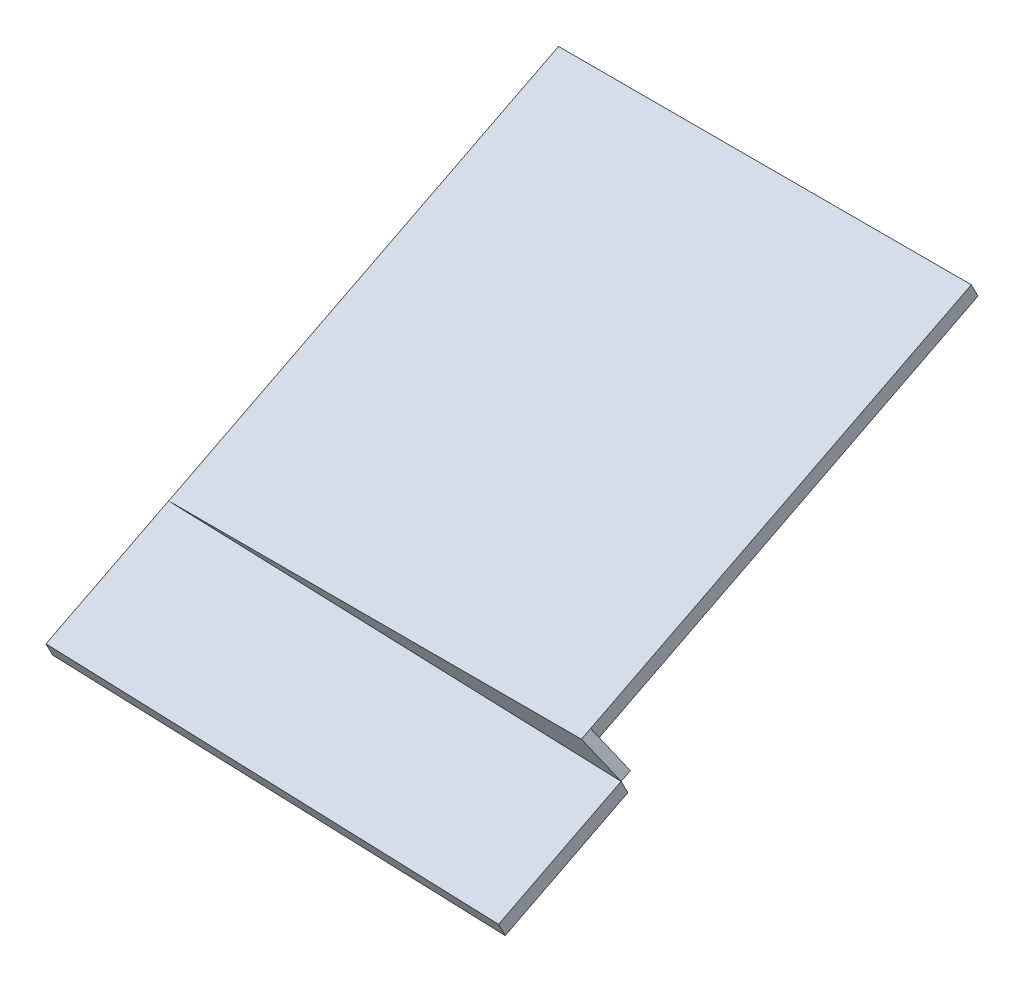
ISO-10303-21;
HEADER;
FILE_DESCRIPTION(('STEP AP214'),'2;1');
FILE_NAME('part.step','',(''),(''),'','','');
FILE_SCHEMA(('AUTOMOTIVE_DESIGN { 1 0 10303 214 1 1 1 1 }'));
ENDSEC;
DATA;
#1=APPLICATION_CONTEXT('core data for automotive mechanical design processes');
#2=APPLICATION_PROTOCOL_DEFINITION('international standard','automotive_design',2000,#1);
#3=PRODUCT_CONTEXT('',#1,'mechanical');
#4=PRODUCT('Part','Part','',(#3));
#5=PRODUCT_RELATED_PRODUCT_CATEGORY('part','',(#4));
#6=PRODUCT_DEFINITION_FORMATION('','',#4);
#7=PRODUCT_DEFINITION_CONTEXT('part definition',#1,'design');
#8=PRODUCT_DEFINITION('design','',#6,#7);
#9=PRODUCT_DEFINITION_SHAPE('','',#8);
#10=(LENGTH_UNIT() NAMED_UNIT(*) SI_UNIT(.MILLI.,.METRE.));
#11=(NAMED_UNIT(*) PLANE_ANGLE_UNIT() SI_UNIT($,.RADIAN.));
#12=(NAMED_UNIT(*) SI_UNIT($,.STERADIAN.) SOLID_ANGLE_UNIT());
#13=UNCERTAINTY_MEASURE_WITH_UNIT(LENGTH_MEASURE(1.E-05),#10,'distance_accuracy_value','');
#14=(GEOMETRIC_REPRESENTATION_CONTEXT(3) GLOBAL_UNCERTAINTY_ASSIGNED_CONTEXT((#13)) GLOBAL_UNIT_ASSIGNED_CONTEXT((#10,
#11,#12)) REPRESENTATION_CONTEXT('',''));
#15=CARTESIAN_POINT('',(0.,0.,0.));
#16=DIRECTION('',(0.,0.,1.));
#17=DIRECTION('',(1.,0.,0.));
#18=AXIS2_PLACEMENT_3D('',#15,#16,#17);
#19=CARTESIAN_POINT('',(1265.16726657652,-195.215914888006,383.132805400998));
#20=DIRECTION('',(1.,0.,0.));
#21=DIRECTION('',(0.,0.,-1.));
#22=AXIS2_PLACEMENT_3D('',#19,#20,#21);
#23=PLANE('',#22);
#24=DIRECTION('',(0.,-0.891006524188367,-0.453990499739548));
#25=VECTOR('',#24,1.);
#26=CARTESIAN_POINT('',(1265.16726657652,-13.6197149921865,26.730195725651));
#27=LINE('',#26,#25);
#28=CARTESIAN_POINT('',(1265.16726657652,-74.1972823783242,-4.13561652604997));
#29=VERTEX_POINT('',#28);
#30=CARTESIAN_POINT('',(1265.16726657652,-112.243260961168,-23.5210108649287));
#31=VERTEX_POINT('',#30);
#32=EDGE_CURVE('E114',#29,#31,#27,.T.);
#33=ORIENTED_EDGE('',*,*,#32,.F.);
#34=DIRECTION('',(0.,0.453990499739548,-0.891006524188367));
#35=VECTOR('',#34,1.);
#36=CARTESIAN_POINT('',(1265.16726657652,-255.793482274144,352.266993149297));
#37=LINE('',#36,#35);
#38=CARTESIAN_POINT('',(1265.16726657652,-255.793482274144,352.266993149297));
#39=VERTEX_POINT('',#38);
#40=EDGE_CURVE('E12',#39,#29,#37,.T.);
#41=ORIENTED_EDGE('',*,*,#40,.F.);
#42=DIRECTION('',(0.,-0.891006524188367,-0.453990499739548));
#43=VECTOR('',#42,1.);
#44=CARTESIAN_POINT('',(1265.16726657652,-195.215914888006,383.132805400998));
#45=LINE('',#44,#43);
#46=CARTESIAN_POINT('',(1265.16726657652,-293.839460856987,332.881598810418));
#47=VERTEX_POINT('',#46);
#48=EDGE_CURVE('E108',#39,#47,#45,.T.);
#49=ORIENTED_EDGE('',*,*,#48,.T.);
#50=DIRECTION('',(0.,0.453990499739548,-0.891006524188367));
#51=VECTOR('',#50,1.);
#52=CARTESIAN_POINT('',(1265.16726657652,-293.839460856987,332.881598810418));
#53=LINE('',#52,#51);
#54=EDGE_CURVE('E89',#47,#31,#53,.T.);
#55=ORIENTED_EDGE('',*,*,#54,.T.);
#56=EDGE_LOOP('',(#33,#41,#49,#55));
#57=FACE_BOUND('',#56,.T.);
#58=ADVANCED_FACE('F51',(#57),#23,.T.);
#59=CARTESIAN_POINT('',(3.70738859318898,-157.458938256924,402.370945890501));
#60=DIRECTION('',(0.0871557427476584,0.887615975361606,0.45226292882456));
#61=DIRECTION('',(0.,-0.453990499739548,0.891006524188367));
#62=AXIS2_PLACEMENT_3D('',#59,#60,#61);
#63=PLANE('',#62);
#64=DIRECTION('',(0.996194698091746,-0.0776563354086466,-0.0395678792051809));
#65=VECTOR('',#64,1.);
#66=CARTESIAN_POINT('',(3.70738859318898,24.1372616388955,45.9683362151538));
#67=LINE('',#66,#65);
#68=CARTESIAN_POINT('',(0.,24.4262635906569,46.1155900645298));
#69=VERTEX_POINT('',#68);
#70=EDGE_CURVE('E102',#69,#29,#67,.T.);
#71=ORIENTED_EDGE('',*,*,#70,.F.);
#72=DIRECTION('',(0.,0.453990499739548,-0.891006524188367));
#73=VECTOR('',#72,1.);
#74=CARTESIAN_POINT('',(0.,-157.169936305162,402.518199739877));
#75=LINE('',#74,#73);
#76=CARTESIAN_POINT('',(0.,-157.169936305162,402.518199739877));
#77=VERTEX_POINT('',#76);
#78=EDGE_CURVE('E59',#77,#69,#75,.T.);
#79=ORIENTED_EDGE('',*,*,#78,.F.);
#80=DIRECTION('',(0.996194698091746,-0.0776563354086466,-0.0395678792051809));
#81=VECTOR('',#80,1.);
#82=CARTESIAN_POINT('',(3.70738859318898,-157.458938256924,402.370945890501));
#83=LINE('',#82,#81);
#84=EDGE_CURVE('E100',#77,#39,#83,.T.);
#85=ORIENTED_EDGE('',*,*,#84,.T.);
#86=ORIENTED_EDGE('',*,*,#40,.T.);
#87=EDGE_LOOP('',(#71,#79,#85,#86));
#88=FACE_BOUND('',#87,.T.);
#89=ADVANCED_FACE('F98',(#88),#63,.T.);
#90=CARTESIAN_POINT('',(0.,-195.215914888006,383.132805400998));
#91=DIRECTION('',(1.,0.,0.));
#92=DIRECTION('',(0.,0.,-1.));
#93=AXIS2_PLACEMENT_3D('',#90,#91,#92);
#94=PLANE('',#93);
#95=DIRECTION('',(0.,-0.891006524188367,-0.453990499739548));
#96=VECTOR('',#95,1.);
#97=CARTESIAN_POINT('',(0.,-13.6197149921865,26.730195725651));
#98=LINE('',#97,#96);
#99=CARTESIAN_POINT('',(0.,-13.6197149921864,26.7301957256509));
#100=VERTEX_POINT('',#99);
#101=EDGE_CURVE('E82',#69,#100,#98,.T.);
#102=ORIENTED_EDGE('',*,*,#101,.T.);
#103=DIRECTION('',(0.,0.453990499739548,-0.891006524188367));
#104=VECTOR('',#103,1.);
#105=CARTESIAN_POINT('',(0.,-195.215914888006,383.132805400998));
#106=LINE('',#105,#104);
#107=CARTESIAN_POINT('',(0.,-195.215914888006,383.132805400998));
#108=VERTEX_POINT('',#107);
#109=EDGE_CURVE('E103',#108,#100,#106,.T.);
#110=ORIENTED_EDGE('',*,*,#109,.F.);
#111=DIRECTION('',(0.,-0.891006524188367,-0.453990499739548));
#112=VECTOR('',#111,1.);
#113=CARTESIAN_POINT('',(0.,-195.215914888006,383.132805400998));
#114=LINE('',#113,#112);
#115=EDGE_CURVE('E104',#77,#108,#114,.T.);
#116=ORIENTED_EDGE('',*,*,#115,.F.);
#117=ORIENTED_EDGE('',*,*,#78,.T.);
#118=EDGE_LOOP('',(#102,#110,#116,#117));
#119=FACE_BOUND('',#118,.T.);
#120=ADVANCED_FACE('F105',(#119),#94,.F.);
#121=CARTESIAN_POINT('',(0.,-195.215914888006,383.132805400998));
#122=DIRECTION('',(0.0871557427476584,0.887615975361606,0.45226292882456));
#123=DIRECTION('',(0.,-0.453990499739548,0.891006524188367));
#124=AXIS2_PLACEMENT_3D('',#121,#122,#123);
#125=PLANE('',#124);
#126=DIRECTION('',(0.996194698091746,-0.0776563354086466,-0.0395678792051809));
#127=VECTOR('',#126,1.);
#128=CARTESIAN_POINT('',(0.,-13.6197149921864,26.7301957256511));
#129=LINE('',#128,#127);
#130=EDGE_CURVE('E110',#100,#31,#129,.T.);
#131=ORIENTED_EDGE('',*,*,#130,.T.);
#132=ORIENTED_EDGE('',*,*,#54,.F.);
#133=DIRECTION('',(0.996194698091746,-0.0776563354086466,-0.0395678792051809));
#134=VECTOR('',#133,1.);
#135=CARTESIAN_POINT('',(0.,-195.215914888006,383.132805400998));
#136=LINE('',#135,#134);
#137=EDGE_CURVE('E67',#108,#47,#136,.T.);
#138=ORIENTED_EDGE('',*,*,#137,.F.);
#139=ORIENTED_EDGE('',*,*,#109,.T.);
#140=EDGE_LOOP('',(#131,#132,#138,#139));
#141=FACE_BOUND('',#140,.T.);
#142=ADVANCED_FACE('F123',(#141),#125,.F.);
#143=CARTESIAN_POINT('',(0.,-195.215914888006,383.132805400998));
#144=DIRECTION('',(0.,-0.453990499739548,0.891006524188367));
#145=DIRECTION('',(0.,-0.891006524188367,-0.453990499739548));
#146=AXIS2_PLACEMENT_3D('',#143,#144,#145);
#147=PLANE('',#146);
#148=ORIENTED_EDGE('',*,*,#48,.F.);
#149=ORIENTED_EDGE('',*,*,#84,.F.);
#150=ORIENTED_EDGE('',*,*,#115,.T.);
#151=ORIENTED_EDGE('',*,*,#137,.T.);
#152=EDGE_LOOP('',(#148,#149,#150,#151));
#153=FACE_BOUND('',#152,.T.);
#154=ADVANCED_FACE('F107',(#153),#147,.T.);
#155=CARTESIAN_POINT('',(0.,-13.6197149921865,26.730195725651));
#156=DIRECTION('',(0.,-0.453990499739548,0.891006524188367));
#157=DIRECTION('',(0.,-0.891006524188367,-0.453990499739548));
#158=AXIS2_PLACEMENT_3D('',#155,#156,#157);
#159=PLANE('',#158);
#160=ORIENTED_EDGE('',*,*,#32,.T.);
#161=ORIENTED_EDGE('',*,*,#130,.F.);
#162=ORIENTED_EDGE('',*,*,#101,.F.);
#163=ORIENTED_EDGE('',*,*,#70,.T.);
#164=EDGE_LOOP('',(#160,#161,#162,#163));
#165=FACE_BOUND('',#164,.T.);
#166=ADVANCED_FACE('F125',(#165),#159,.F.);
#167=CLOSED_SHELL('',(#58,#89,#120,#142,#154,#166));
#168=MANIFOLD_SOLID_BREP('B2',#167);
#169=CARTESIAN_POINT('',(1200.,0.,0.));
#170=DIRECTION('',(0.,0.453990499739548,-0.891006524188367));
#171=DIRECTION('',(0.,0.891006524188367,0.453990499739548));
#172=AXIS2_PLACEMENT_3D('',#169,#170,#171);
#173=PLANE('',#172);
#174=DIRECTION('',(-1.,0.,0.));
#175=VECTOR('',#174,1.);
#176=CARTESIAN_POINT('',(1200.,0.,0.));
#177=LINE('',#176,#175);
#178=CARTESIAN_POINT('',(488.063233327918,-3.52406345063167E-13,-1.54079638809851E-13));
#179=VERTEX_POINT('',#178);
#180=CARTESIAN_POINT('',(0.,0.,0.));
#181=VERTEX_POINT('',#180);
#182=EDGE_CURVE('E187',#179,#181,#177,.T.);
#183=ORIENTED_EDGE('',*,*,#182,.F.);
#184=DIRECTION('',(0.996194698091746,-0.0776563354086466,-0.0395678792051809));
#185=VECTOR('',#184,1.);
#186=CARTESIAN_POINT('',(3.70738859318898,37.7569766310819,19.2381404895028));
#187=LINE('',#186,#185);
#188=CARTESIAN_POINT('',(0.,38.0459785828433,19.3853943388787));
#189=VERTEX_POINT('',#188);
#190=EDGE_CURVE('E265',#189,#179,#187,.T.);
#191=ORIENTED_EDGE('',*,*,#190,.F.);
#192=DIRECTION('',(0.,-0.891006524188367,-0.453990499739548));
#193=VECTOR('',#192,1.);
#194=CARTESIAN_POINT('',(0.,0.,0.));
#195=LINE('',#194,#193);
#196=EDGE_CURVE('E284',#189,#181,#195,.T.);
#197=ORIENTED_EDGE('',*,*,#196,.T.);
#198=EDGE_LOOP('',(#183,#191,#197));
#199=FACE_BOUND('',#198,.T.);
#200=ADVANCED_FACE('F178',(#199),#173,.F.);
#201=CARTESIAN_POINT('',(1200.,0.,0.));
#202=DIRECTION('',(0.,0.891006524188367,0.453990499739548));
#203=DIRECTION('',(0.,-0.453990499739548,0.891006524188367));
#204=AXIS2_PLACEMENT_3D('',#201,#202,#203);
#205=PLANE('',#204);
#206=DIRECTION('',(0.,0.453990499739548,-0.891006524188367));
#207=VECTOR('',#206,1.);
#208=CARTESIAN_POINT('',(0.,0.,0.));
#209=LINE('',#208,#207);
#210=CARTESIAN_POINT('',(0.,563.810801626545,-1106.54100238953));
#211=VERTEX_POINT('',#210);
#212=EDGE_CURVE('E209',#181,#211,#209,.T.);
#213=ORIENTED_EDGE('',*,*,#212,.T.);
#214=DIRECTION('',(-1.,0.,0.));
#215=VECTOR('',#214,1.);
#216=CARTESIAN_POINT('',(1200.,563.810801626545,-1106.54100238953));
#217=LINE('',#216,#215);
#218=CARTESIAN_POINT('',(1200.,563.810801626545,-1106.54100238953));
#219=VERTEX_POINT('',#218);
#220=EDGE_CURVE('E279',#219,#211,#217,.T.);
#221=ORIENTED_EDGE('',*,*,#220,.F.);
#222=DIRECTION('',(0.,0.453990499739548,-0.891006524188367));
#223=VECTOR('',#222,1.);
#224=CARTESIAN_POINT('',(1200.,0.,0.));
#225=LINE('',#224,#223);
#226=CARTESIAN_POINT('',(1200.,0.,0.));
#227=VERTEX_POINT('',#226);
#228=EDGE_CURVE('E248',#227,#219,#225,.T.);
#229=ORIENTED_EDGE('',*,*,#228,.F.);
#230=EDGE_CURVE('E49',#227,#179,#177,.T.);
#231=ORIENTED_EDGE('',*,*,#230,.T.);
#232=ORIENTED_EDGE('',*,*,#182,.T.);
#233=EDGE_LOOP('',(#213,#221,#229,#231,#232));
#234=FACE_BOUND('',#233,.T.);
#235=ADVANCED_FACE('F296',(#234),#205,.F.);
#236=CARTESIAN_POINT('',(1200.,563.810801626545,-1106.54100238953));
#237=DIRECTION('',(0.,-0.453990499739547,0.891006524188368));
#238=DIRECTION('',(0.,-0.891006524188368,-0.453990499739547));
#239=AXIS2_PLACEMENT_3D('',#236,#237,#238);
#240=PLANE('',#239);
#241=DIRECTION('',(0.,0.891006524188368,0.453990499739547));
#242=VECTOR('',#241,1.);
#243=CARTESIAN_POINT('',(0.,563.810801626545,-1106.54100238953));
#244=LINE('',#243,#242);
#245=CARTESIAN_POINT('',(0.,601.856780209388,-1087.15560805065));
#246=VERTEX_POINT('',#245);
#247=EDGE_CURVE('E214',#211,#246,#244,.T.);
#248=ORIENTED_EDGE('',*,*,#247,.T.);
#249=DIRECTION('',(-1.,0.,0.));
#250=VECTOR('',#249,1.);
#251=CARTESIAN_POINT('',(1200.,601.856780209388,-1087.15560805065));
#252=LINE('',#251,#250);
#253=CARTESIAN_POINT('',(1200.,601.856780209388,-1087.15560805065));
#254=VERTEX_POINT('',#253);
#255=EDGE_CURVE('E275',#254,#246,#252,.T.);
#256=ORIENTED_EDGE('',*,*,#255,.F.);
#257=DIRECTION('',(0.,0.891006524188368,0.453990499739547));
#258=VECTOR('',#257,1.);
#259=CARTESIAN_POINT('',(1200.,563.810801626545,-1106.54100238953));
#260=LINE('',#259,#258);
#261=EDGE_CURVE('E195',#219,#254,#260,.T.);
#262=ORIENTED_EDGE('',*,*,#261,.F.);
#263=ORIENTED_EDGE('',*,*,#220,.T.);
#264=EDGE_LOOP('',(#248,#256,#262,#263));
#265=FACE_BOUND('',#264,.T.);
#266=ADVANCED_FACE('F307',(#265),#240,.F.);
#267=CARTESIAN_POINT('',(1200.,38.0459785828433,19.3853943388787));
#268=DIRECTION('',(0.,-0.891006524188367,-0.453990499739548));
#269=DIRECTION('',(0.,0.453990499739548,-0.891006524188367));
#270=AXIS2_PLACEMENT_3D('',#267,#268,#269);
#271=PLANE('',#270);
#272=DIRECTION('',(0.,-0.453990499739548,0.891006524188367));
#273=VECTOR('',#272,1.);
#274=CARTESIAN_POINT('',(0.,38.0459785828433,19.3853943388787));
#275=LINE('',#274,#273);
#276=EDGE_CURVE('E249',#246,#189,#275,.T.);
#277=ORIENTED_EDGE('',*,*,#276,.T.);
#278=DIRECTION('',(0.,-0.453990499739548,0.891006524188367));
#279=VECTOR('',#278,1.);
#280=CARTESIAN_POINT('',(0.,38.0459785828433,19.3853943388787));
#281=LINE('',#280,#279);
#282=CARTESIAN_POINT('',(0.,24.4262635906569,46.1155900645298));
#283=VERTEX_POINT('',#282);
#284=EDGE_CURVE('E264',#189,#283,#281,.T.);
#285=ORIENTED_EDGE('',*,*,#284,.T.);
#286=DIRECTION('',(1.,0.,0.));
#287=VECTOR('',#286,1.);
#288=CARTESIAN_POINT('',(0.,24.4262635906568,46.1155900645297));
#289=LINE('',#288,#287);
#290=CARTESIAN_POINT('',(1200.,24.4262635906568,46.1155900645297));
#291=VERTEX_POINT('',#290);
#292=EDGE_CURVE('E259',#283,#291,#289,.T.);
#293=ORIENTED_EDGE('',*,*,#292,.T.);
#294=DIRECTION('',(0.,-0.453990499739548,0.891006524188367));
#295=VECTOR('',#294,1.);
#296=CARTESIAN_POINT('',(1200.,38.0459785828433,19.3853943388787));
#297=LINE('',#296,#295);
#298=CARTESIAN_POINT('',(1200.,38.0459785828433,19.3853943388787));
#299=VERTEX_POINT('',#298);
#300=EDGE_CURVE('E254',#299,#291,#297,.T.);
#301=ORIENTED_EDGE('',*,*,#300,.F.);
#302=DIRECTION('',(0.,-0.453990499739548,0.891006524188367));
#303=VECTOR('',#302,1.);
#304=CARTESIAN_POINT('',(1200.,38.0459785828433,19.3853943388787));
#305=LINE('',#304,#303);
#306=EDGE_CURVE('E257',#254,#299,#305,.T.);
#307=ORIENTED_EDGE('',*,*,#306,.F.);
#308=ORIENTED_EDGE('',*,*,#255,.T.);
#309=EDGE_LOOP('',(#277,#285,#293,#301,#307,#308));
#310=FACE_BOUND('',#309,.T.);
#311=ADVANCED_FACE('F256',(#310),#271,.F.);
#312=CARTESIAN_POINT('',(1200.,0.,0.));
#313=DIRECTION('',(-1.,0.,0.));
#314=DIRECTION('',(0.,0.,1.));
#315=AXIS2_PLACEMENT_3D('',#312,#313,#314);
#316=PLANE('',#315);
#317=DIRECTION('',(0.,-0.891006524188367,-0.453990499739548));
#318=VECTOR('',#317,1.);
#319=CARTESIAN_POINT('',(1200.,0.,0.));
#320=LINE('',#319,#318);
#321=EDGE_CURVE('E241',#299,#227,#320,.T.);
#322=ORIENTED_EDGE('',*,*,#321,.T.);
#323=ORIENTED_EDGE('',*,*,#228,.T.);
#324=ORIENTED_EDGE('',*,*,#261,.T.);
#325=ORIENTED_EDGE('',*,*,#306,.T.);
#326=EDGE_LOOP('',(#322,#323,#324,#325));
#327=FACE_BOUND('',#326,.T.);
#328=ADVANCED_FACE('F273',(#327),#316,.F.);
#329=CARTESIAN_POINT('',(0.,0.,0.));
#330=DIRECTION('',(-1.,0.,0.));
#331=DIRECTION('',(0.,0.,1.));
#332=AXIS2_PLACEMENT_3D('',#329,#330,#331);
#333=PLANE('',#332);
#334=ORIENTED_EDGE('',*,*,#196,.F.);
#335=ORIENTED_EDGE('',*,*,#276,.F.);
#336=ORIENTED_EDGE('',*,*,#247,.F.);
#337=ORIENTED_EDGE('',*,*,#212,.F.);
#338=EDGE_LOOP('',(#334,#335,#336,#337));
#339=FACE_BOUND('',#338,.T.);
#340=ADVANCED_FACE('F301',(#339),#333,.T.);
#341=CARTESIAN_POINT('',(0.,0.,0.));
#342=DIRECTION('',(0.,-0.453990499739548,0.891006524188367));
#343=DIRECTION('',(0.,-0.891006524188367,-0.453990499739548));
#344=AXIS2_PLACEMENT_3D('',#341,#342,#343);
#345=PLANE('',#344);
#346=CARTESIAN_POINT('',(1265.16726657652,-60.5775673861378,-30.865812251701));
#347=VERTEX_POINT('',#346);
#348=EDGE_CURVE('E270',#179,#347,#187,.T.);
#349=ORIENTED_EDGE('',*,*,#348,.F.);
#350=ORIENTED_EDGE('',*,*,#230,.F.);
#351=ORIENTED_EDGE('',*,*,#321,.F.);
#352=DIRECTION('',(0.507348618242453,-0.76781676449146,-0.391222182056871));
#353=VECTOR('',#352,1.);
#354=CARTESIAN_POINT('',(909.785425935605,477.254064017903,243.173091491766));
#355=LINE('',#354,#353);
#356=EDGE_CURVE('E245',#299,#347,#355,.T.);
#357=ORIENTED_EDGE('',*,*,#356,.T.);
#358=EDGE_LOOP('',(#349,#350,#351,#357));
#359=FACE_BOUND('',#358,.T.);
#360=ADVANCED_FACE('F243',(#359),#345,.F.);
#361=CARTESIAN_POINT('',(909.785425935605,477.254064017903,243.173091491766));
#362=DIRECTION('',(-0.861740900484289,-0.452050928891979,-0.23033145273806));
#363=DIRECTION('',(0.464541409140182,-0.885551398392015,0.));
#364=AXIS2_PLACEMENT_3D('',#361,#362,#363);
#365=PLANE('',#364);
#366=DIRECTION('',(0.507348618242453,-0.76781676449146,-0.391222182056871));
#367=VECTOR('',#366,1.);
#368=CARTESIAN_POINT('',(909.785425935605,463.634349025717,269.903287217417));
#369=LINE('',#368,#367);
#370=CARTESIAN_POINT('',(1265.16726657652,-74.1972823783242,-4.13561652604997));
#371=VERTEX_POINT('',#370);
#372=EDGE_CURVE('E388',#291,#371,#369,.T.);
#373=ORIENTED_EDGE('',*,*,#372,.T.);
#374=DIRECTION('',(0.,-0.453990499739548,0.891006524188367));
#375=VECTOR('',#374,1.);
#376=CARTESIAN_POINT('',(1265.16726657652,-60.5775673861378,-30.865812251701));
#377=LINE('',#376,#375);
#378=EDGE_CURVE('E268',#347,#371,#377,.T.);
#379=ORIENTED_EDGE('',*,*,#378,.F.);
#380=ORIENTED_EDGE('',*,*,#356,.F.);
#381=ORIENTED_EDGE('',*,*,#300,.T.);
#382=EDGE_LOOP('',(#373,#379,#380,#381));
#383=FACE_BOUND('',#382,.T.);
#384=ADVANCED_FACE('F267',(#383),#365,.F.);
#385=CARTESIAN_POINT('',(3.70738859318898,37.7569766310819,19.2381404895028));
#386=DIRECTION('',(-0.0871557427476584,-0.887615975361606,-0.45226292882456));
#387=DIRECTION('',(0.,0.453990499739548,-0.891006524188367));
#388=AXIS2_PLACEMENT_3D('',#385,#386,#387);
#389=PLANE('',#388);
#390=DIRECTION('',(0.996194698091746,-0.0776563354086466,-0.0395678792051809));
#391=VECTOR('',#390,1.);
#392=CARTESIAN_POINT('',(3.70738859318898,24.1372616388955,45.9683362151538));
#393=LINE('',#392,#391);
#394=EDGE_CURVE('E271',#283,#371,#393,.T.);
#395=ORIENTED_EDGE('',*,*,#394,.F.);
#396=ORIENTED_EDGE('',*,*,#284,.F.);
#397=ORIENTED_EDGE('',*,*,#190,.T.);
#398=ORIENTED_EDGE('',*,*,#348,.T.);
#399=ORIENTED_EDGE('',*,*,#378,.T.);
#400=EDGE_LOOP('',(#395,#396,#397,#398,#399));
#401=FACE_BOUND('',#400,.T.);
#402=ADVANCED_FACE('F364',(#401),#389,.T.);
#403=CARTESIAN_POINT('',(0.,-13.6197149921865,26.730195725651));
#404=DIRECTION('',(0.,-0.453990499739548,0.891006524188367));
#405=DIRECTION('',(0.,-0.891006524188367,-0.453990499739548));
#406=AXIS2_PLACEMENT_3D('',#403,#404,#405);
#407=PLANE('',#406);
#408=ORIENTED_EDGE('',*,*,#372,.F.);
#409=ORIENTED_EDGE('',*,*,#292,.F.);
#410=ORIENTED_EDGE('',*,*,#394,.T.);
#411=EDGE_LOOP('',(#408,#409,#410));
#412=FACE_BOUND('',#411,.T.);
#413=ADVANCED_FACE('F374',(#412),#407,.T.);
#414=CLOSED_SHELL('',(#200,#235,#266,#311,#328,#340,#360,#384,#402,#413));
#415=MANIFOLD_SOLID_BREP('B6',#414);
#416=ADVANCED_BREP_SHAPE_REPRESENTATION('',(#18,#168,#415),#14);
#417=SHAPE_DEFINITION_REPRESENTATION(#9,#416);
ENDSEC;
END-ISO-10303-21;
